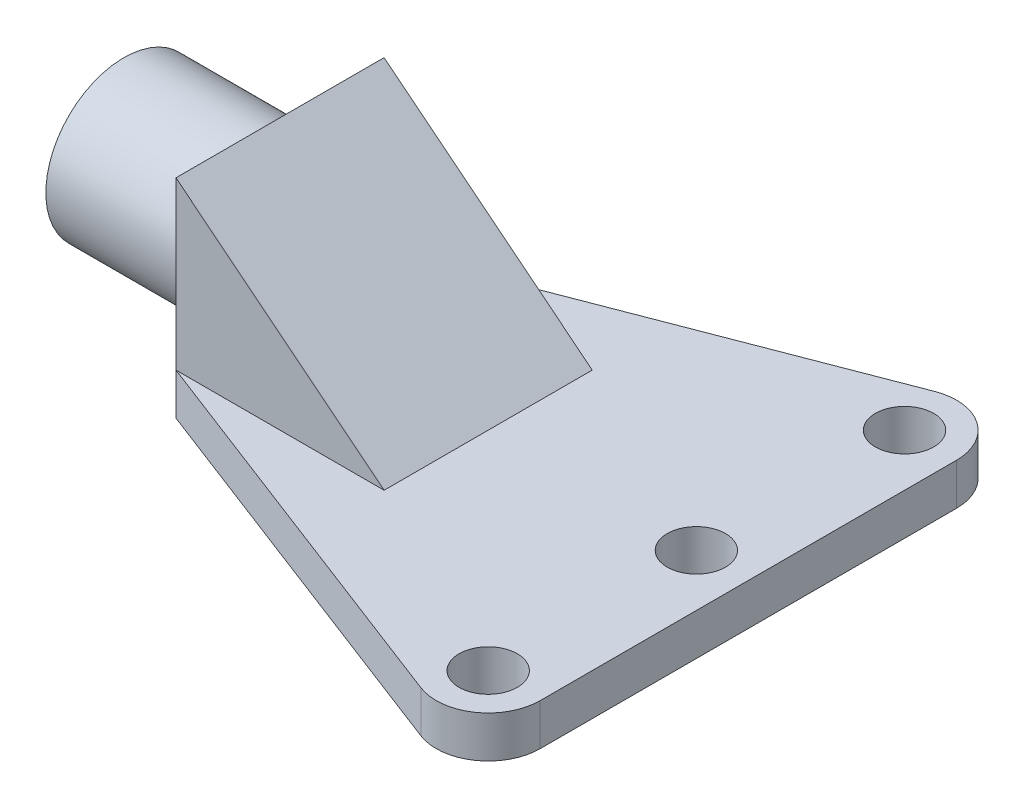
ISO-10303-21;
HEADER;
FILE_DESCRIPTION(('STEP AP214'),'2;1');
FILE_NAME('part.step','',(''),(''),'','','');
FILE_SCHEMA(('AUTOMOTIVE_DESIGN { 1 0 10303 214 1 1 1 1 }'));
ENDSEC;
DATA;
#1=APPLICATION_CONTEXT('core data for automotive mechanical design processes');
#2=APPLICATION_PROTOCOL_DEFINITION('international standard','automotive_design',2000,#1);
#3=PRODUCT_CONTEXT('',#1,'mechanical');
#4=PRODUCT('Part','Part','',(#3));
#5=PRODUCT_RELATED_PRODUCT_CATEGORY('part','',(#4));
#6=PRODUCT_DEFINITION_FORMATION('','',#4);
#7=PRODUCT_DEFINITION_CONTEXT('part definition',#1,'design');
#8=PRODUCT_DEFINITION('design','',#6,#7);
#9=PRODUCT_DEFINITION_SHAPE('','',#8);
#10=(LENGTH_UNIT() NAMED_UNIT(*) SI_UNIT(.MILLI.,.METRE.));
#11=(NAMED_UNIT(*) PLANE_ANGLE_UNIT() SI_UNIT($,.RADIAN.));
#12=(NAMED_UNIT(*) SI_UNIT($,.STERADIAN.) SOLID_ANGLE_UNIT());
#13=UNCERTAINTY_MEASURE_WITH_UNIT(LENGTH_MEASURE(1.E-05),#10,'distance_accuracy_value','');
#14=(GEOMETRIC_REPRESENTATION_CONTEXT(3) GLOBAL_UNCERTAINTY_ASSIGNED_CONTEXT((#13)) GLOBAL_UNIT_ASSIGNED_CONTEXT((#10,
#11,#12)) REPRESENTATION_CONTEXT('',''));
#15=CARTESIAN_POINT('',(0.,0.,0.));
#16=DIRECTION('',(0.,0.,1.));
#17=DIRECTION('',(1.,0.,0.));
#18=AXIS2_PLACEMENT_3D('',#15,#16,#17);
#19=CARTESIAN_POINT('',(0.,5.08,-25.4));
#20=DIRECTION('',(0.,1.,0.));
#21=DIRECTION('',(0.,0.,1.));
#22=AXIS2_PLACEMENT_3D('',#19,#20,#21);
#23=PLANE('',#22);
#24=CARTESIAN_POINT('',(0.,5.08,0.));
#25=DIRECTION('',(0.,1.,0.));
#26=DIRECTION('',(0.,0.,1.));
#27=AXIS2_PLACEMENT_3D('',#24,#25,#26);
#28=CIRCLE('',#27,3.556);
#29=CARTESIAN_POINT('',(0.,5.08,-3.556));
#30=VERTEX_POINT('',#29);
#31=EDGE_CURVE('E206',#30,#30,#28,.T.);
#32=ORIENTED_EDGE('',*,*,#31,.F.);
#33=EDGE_LOOP('',(#32));
#34=FACE_BOUND('',#33,.T.);
#35=CARTESIAN_POINT('',(0.,5.08,-25.4));
#36=DIRECTION('',(0.,1.,0.));
#37=DIRECTION('',(0.,0.,1.));
#38=AXIS2_PLACEMENT_3D('',#35,#36,#37);
#39=CIRCLE('',#38,3.556);
#40=CARTESIAN_POINT('',(0.,5.08,-28.956));
#41=VERTEX_POINT('',#40);
#42=EDGE_CURVE('E144',#41,#41,#39,.T.);
#43=ORIENTED_EDGE('',*,*,#42,.F.);
#44=EDGE_LOOP('',(#43));
#45=FACE_BOUND('',#44,.T.);
#46=CARTESIAN_POINT('',(0.,5.08,25.4));
#47=DIRECTION('',(0.,1.,0.));
#48=DIRECTION('',(0.,0.,1.));
#49=AXIS2_PLACEMENT_3D('',#46,#47,#48);
#50=CIRCLE('',#49,3.556);
#51=CARTESIAN_POINT('',(0.,5.08,21.844));
#52=VERTEX_POINT('',#51);
#53=EDGE_CURVE('E150',#52,#52,#50,.T.);
#54=ORIENTED_EDGE('',*,*,#53,.F.);
#55=EDGE_LOOP('',(#54));
#56=FACE_BOUND('',#55,.T.);
#57=DIRECTION('',(-0.933570914337952,0.,0.35839272858444));
#58=VECTOR('',#57,1.);
#59=CARTESIAN_POINT('',(-50.8,5.08,-12.7));
#60=LINE('',#59,#58);
#61=CARTESIAN_POINT('',(-2.27579382651031,5.08,-31.3281753060437));
#62=VERTEX_POINT('',#61);
#63=CARTESIAN_POINT('',(-50.8,5.08,-12.7));
#64=VERTEX_POINT('',#63);
#65=EDGE_CURVE('E129',#62,#64,#60,.T.);
#66=ORIENTED_EDGE('',*,*,#65,.T.);
#67=DIRECTION('',(1.,0.,0.));
#68=VECTOR('',#67,1.);
#69=CARTESIAN_POINT('',(0.,5.08,-12.7));
#70=LINE('',#69,#68);
#71=CARTESIAN_POINT('',(-25.4,5.08,-12.7));
#72=VERTEX_POINT('',#71);
#73=EDGE_CURVE('E123',#64,#72,#70,.T.);
#74=ORIENTED_EDGE('',*,*,#73,.T.);
#75=DIRECTION('',(0.,0.,-1.));
#76=VECTOR('',#75,1.);
#77=CARTESIAN_POINT('',(-25.4,5.08,31.7507145946854));
#78=LINE('',#77,#76);
#79=CARTESIAN_POINT('',(-25.4,5.08,12.7));
#80=VERTEX_POINT('',#79);
#81=EDGE_CURVE('E111',#80,#72,#78,.T.);
#82=ORIENTED_EDGE('',*,*,#81,.F.);
#83=DIRECTION('',(-1.,0.,0.));
#84=VECTOR('',#83,1.);
#85=CARTESIAN_POINT('',(0.,5.08,12.7));
#86=LINE('',#85,#84);
#87=CARTESIAN_POINT('',(-50.8,5.08,12.7));
#88=VERTEX_POINT('',#87);
#89=EDGE_CURVE('E131',#80,#88,#86,.T.);
#90=ORIENTED_EDGE('',*,*,#89,.T.);
#91=DIRECTION('',(0.933572882255343,0.,0.358387602348981));
#92=VECTOR('',#91,1.);
#93=CARTESIAN_POINT('',(-50.8,5.08,12.7));
#94=LINE('',#93,#92);
#95=CARTESIAN_POINT('',(-2.27565898918961,5.08,31.3279213556592));
#96=VERTEX_POINT('',#95);
#97=EDGE_CURVE('E89',#88,#96,#94,.T.);
#98=ORIENTED_EDGE('',*,*,#97,.T.);
#99=CARTESIAN_POINT('',(0.,5.08,25.4));
#100=DIRECTION('',(0.,1.,0.));
#101=DIRECTION('',(0.,0.,1.));
#102=AXIS2_PLACEMENT_3D('',#99,#100,#101);
#103=CIRCLE('',#102,6.34971459468536);
#104=CARTESIAN_POINT('',(6.34971459468536,5.08,25.4));
#105=VERTEX_POINT('',#104);
#106=EDGE_CURVE('E155',#96,#105,#103,.T.);
#107=ORIENTED_EDGE('',*,*,#106,.T.);
#108=DIRECTION('',(5.61821480663238E-06,0.,-0.999999999984218));
#109=VECTOR('',#108,1.);
#110=CARTESIAN_POINT('',(6.34999999999754,5.08,-25.4));
#111=LINE('',#110,#109);
#112=CARTESIAN_POINT('',(6.34999999999754,5.08,-25.4));
#113=VERTEX_POINT('',#112);
#114=EDGE_CURVE('E157',#105,#113,#111,.T.);
#115=ORIENTED_EDGE('',*,*,#114,.T.);
#116=CARTESIAN_POINT('',(0.,5.08,-25.4));
#117=DIRECTION('',(0.,1.,0.));
#118=DIRECTION('',(0.,0.,1.));
#119=AXIS2_PLACEMENT_3D('',#116,#117,#118);
#120=CIRCLE('',#119,6.34999999999754);
#121=EDGE_CURVE('E52',#113,#62,#120,.T.);
#122=ORIENTED_EDGE('',*,*,#121,.T.);
#123=EDGE_LOOP('',(#66,#74,#82,#90,#98,#107,#115,#122));
#124=FACE_BOUND('',#123,.T.);
#125=ADVANCED_FACE('F35',(#34,#45,#56,#124),#23,.T.);
#126=CARTESIAN_POINT('',(-50.8,5.08,12.7));
#127=DIRECTION('',(1.,0.,0.));
#128=DIRECTION('',(0.,0.,-1.));
#129=AXIS2_PLACEMENT_3D('',#126,#127,#128);
#130=PLANE('',#129);
#131=DIRECTION('',(0.,-1.,0.));
#132=VECTOR('',#131,1.);
#133=CARTESIAN_POINT('',(-50.8,5.08,12.7));
#134=LINE('',#133,#132);
#135=CARTESIAN_POINT('',(-50.8,0.,12.7));
#136=VERTEX_POINT('',#135);
#137=EDGE_CURVE('E11',#88,#136,#134,.T.);
#138=ORIENTED_EDGE('',*,*,#137,.F.);
#139=DIRECTION('',(0.,-1.,0.));
#140=VECTOR('',#139,1.);
#141=CARTESIAN_POINT('',(-50.8,25.4,12.7));
#142=LINE('',#141,#140);
#143=CARTESIAN_POINT('',(-50.8,25.4,12.7));
#144=VERTEX_POINT('',#143);
#145=EDGE_CURVE('E201',#144,#88,#142,.T.);
#146=ORIENTED_EDGE('',*,*,#145,.F.);
#147=DIRECTION('',(0.,0.,1.));
#148=VECTOR('',#147,1.);
#149=CARTESIAN_POINT('',(-50.8,25.4,12.7));
#150=LINE('',#149,#148);
#151=CARTESIAN_POINT('',(-50.8,25.4,-12.7));
#152=VERTEX_POINT('',#151);
#153=EDGE_CURVE('E119',#152,#144,#150,.T.);
#154=ORIENTED_EDGE('',*,*,#153,.F.);
#155=DIRECTION('',(0.,-1.,0.));
#156=VECTOR('',#155,1.);
#157=CARTESIAN_POINT('',(-50.8,25.4,-12.7));
#158=LINE('',#157,#156);
#159=EDGE_CURVE('E125',#152,#64,#158,.T.);
#160=ORIENTED_EDGE('',*,*,#159,.T.);
#161=DIRECTION('',(0.,-1.,0.));
#162=VECTOR('',#161,1.);
#163=CARTESIAN_POINT('',(-50.8,5.08,-12.7));
#164=LINE('',#163,#162);
#165=CARTESIAN_POINT('',(-50.8,0.,-12.7));
#166=VERTEX_POINT('',#165);
#167=EDGE_CURVE('E161',#64,#166,#164,.T.);
#168=ORIENTED_EDGE('',*,*,#167,.T.);
#169=DIRECTION('',(0.,0.,1.));
#170=VECTOR('',#169,1.);
#171=CARTESIAN_POINT('',(-50.8,0.,12.7));
#172=LINE('',#171,#170);
#173=EDGE_CURVE('E153',#166,#136,#172,.T.);
#174=ORIENTED_EDGE('',*,*,#173,.T.);
#175=EDGE_LOOP('',(#138,#146,#154,#160,#168,#174));
#176=FACE_BOUND('',#175,.T.);
#177=CARTESIAN_POINT('',(-50.8,12.7,0.));
#178=DIRECTION('',(-1.,0.,0.));
#179=DIRECTION('',(0.,0.,1.));
#180=AXIS2_PLACEMENT_3D('',#177,#178,#179);
#181=CIRCLE('',#180,9.525);
#182=CARTESIAN_POINT('',(-50.8,12.7,-9.525));
#183=VERTEX_POINT('',#182);
#184=EDGE_CURVE('E130',#183,#183,#181,.T.);
#185=ORIENTED_EDGE('',*,*,#184,.F.);
#186=EDGE_LOOP('',(#185));
#187=FACE_BOUND('',#186,.T.);
#188=ADVANCED_FACE('F37',(#176,#187),#130,.F.);
#189=CARTESIAN_POINT('',(-50.8,5.08,12.7));
#190=DIRECTION('',(0.358387602348981,0.,-0.933572882255343));
#191=DIRECTION('',(-0.933572882255343,0.,-0.358387602348981));
#192=AXIS2_PLACEMENT_3D('',#189,#190,#191);
#193=PLANE('',#192);
#194=DIRECTION('',(0.933572882255343,0.,0.358387602348981));
#195=VECTOR('',#194,1.);
#196=CARTESIAN_POINT('',(-50.8,0.,12.7));
#197=LINE('',#196,#195);
#198=CARTESIAN_POINT('',(-2.27565898918961,0.,31.3279213556592));
#199=VERTEX_POINT('',#198);
#200=EDGE_CURVE('E164',#136,#199,#197,.T.);
#201=ORIENTED_EDGE('',*,*,#200,.T.);
#202=DIRECTION('',(0.,-1.,0.));
#203=VECTOR('',#202,1.);
#204=CARTESIAN_POINT('',(-2.27565898918961,5.08,31.3279213556592));
#205=LINE('',#204,#203);
#206=EDGE_CURVE('E44',#96,#199,#205,.T.);
#207=ORIENTED_EDGE('',*,*,#206,.F.);
#208=ORIENTED_EDGE('',*,*,#97,.F.);
#209=ORIENTED_EDGE('',*,*,#137,.T.);
#210=EDGE_LOOP('',(#201,#207,#208,#209));
#211=FACE_BOUND('',#210,.T.);
#212=ADVANCED_FACE('F229',(#211),#193,.F.);
#213=CARTESIAN_POINT('',(0.,5.08,25.4));
#214=DIRECTION('',(0.,-1.,0.));
#215=DIRECTION('',(0.,0.,-1.));
#216=AXIS2_PLACEMENT_3D('',#213,#214,#215);
#217=CYLINDRICAL_SURFACE('',#216,6.34971459468536);
#218=CARTESIAN_POINT('',(0.,0.,25.4));
#219=DIRECTION('',(0.,1.,0.));
#220=DIRECTION('',(0.,0.,1.));
#221=AXIS2_PLACEMENT_3D('',#218,#219,#220);
#222=CIRCLE('',#221,6.34971459468536);
#223=CARTESIAN_POINT('',(6.34971459468536,0.,25.4));
#224=VERTEX_POINT('',#223);
#225=EDGE_CURVE('E166',#199,#224,#222,.T.);
#226=ORIENTED_EDGE('',*,*,#225,.T.);
#227=DIRECTION('',(0.,-1.,0.));
#228=VECTOR('',#227,1.);
#229=CARTESIAN_POINT('',(6.34971459468536,5.08,25.4));
#230=LINE('',#229,#228);
#231=EDGE_CURVE('E177',#105,#224,#230,.T.);
#232=ORIENTED_EDGE('',*,*,#231,.F.);
#233=ORIENTED_EDGE('',*,*,#106,.F.);
#234=ORIENTED_EDGE('',*,*,#206,.T.);
#235=EDGE_LOOP('',(#226,#232,#233,#234));
#236=FACE_BOUND('',#235,.T.);
#237=ADVANCED_FACE('F183',(#236),#217,.T.);
#238=CARTESIAN_POINT('',(6.34999999999754,5.08,-25.4));
#239=DIRECTION('',(-0.999999999984218,0.,-5.61821480663238E-06));
#240=DIRECTION('',(-5.61821480663238E-06,0.,0.999999999984218));
#241=AXIS2_PLACEMENT_3D('',#238,#239,#240);
#242=PLANE('',#241);
#243=DIRECTION('',(5.61821480663238E-06,0.,-0.999999999984218));
#244=VECTOR('',#243,1.);
#245=CARTESIAN_POINT('',(6.34999999999754,0.,-25.4));
#246=LINE('',#245,#244);
#247=CARTESIAN_POINT('',(6.34999999999754,0.,-25.4));
#248=VERTEX_POINT('',#247);
#249=EDGE_CURVE('E168',#224,#248,#246,.T.);
#250=ORIENTED_EDGE('',*,*,#249,.T.);
#251=DIRECTION('',(0.,-1.,0.));
#252=VECTOR('',#251,1.);
#253=CARTESIAN_POINT('',(6.34999999999754,5.08,-25.4));
#254=LINE('',#253,#252);
#255=EDGE_CURVE('E175',#113,#248,#254,.T.);
#256=ORIENTED_EDGE('',*,*,#255,.F.);
#257=ORIENTED_EDGE('',*,*,#114,.F.);
#258=ORIENTED_EDGE('',*,*,#231,.T.);
#259=EDGE_LOOP('',(#250,#256,#257,#258));
#260=FACE_BOUND('',#259,.T.);
#261=ADVANCED_FACE('F193',(#260),#242,.F.);
#262=CARTESIAN_POINT('',(0.,5.08,-25.4));
#263=DIRECTION('',(0.,-1.,0.));
#264=DIRECTION('',(0.,0.,-1.));
#265=AXIS2_PLACEMENT_3D('',#262,#263,#264);
#266=CYLINDRICAL_SURFACE('',#265,6.34999999999754);
#267=CARTESIAN_POINT('',(0.,0.,-25.4));
#268=DIRECTION('',(0.,1.,0.));
#269=DIRECTION('',(0.,0.,1.));
#270=AXIS2_PLACEMENT_3D('',#267,#268,#269);
#271=CIRCLE('',#270,6.34999999999754);
#272=CARTESIAN_POINT('',(-2.27579382651031,0.,-31.3281753060437));
#273=VERTEX_POINT('',#272);
#274=EDGE_CURVE('E75',#248,#273,#271,.T.);
#275=ORIENTED_EDGE('',*,*,#274,.T.);
#276=DIRECTION('',(0.,-1.,0.));
#277=VECTOR('',#276,1.);
#278=CARTESIAN_POINT('',(-2.27579382651031,5.08,-31.3281753060437));
#279=LINE('',#278,#277);
#280=EDGE_CURVE('E173',#62,#273,#279,.T.);
#281=ORIENTED_EDGE('',*,*,#280,.F.);
#282=ORIENTED_EDGE('',*,*,#121,.F.);
#283=ORIENTED_EDGE('',*,*,#255,.T.);
#284=EDGE_LOOP('',(#275,#281,#282,#283));
#285=FACE_BOUND('',#284,.T.);
#286=ADVANCED_FACE('F195',(#285),#266,.T.);
#287=CARTESIAN_POINT('',(-50.8,5.08,-12.7));
#288=DIRECTION('',(0.35839272858444,0.,0.933570914337952));
#289=DIRECTION('',(0.933570914337952,0.,-0.35839272858444));
#290=AXIS2_PLACEMENT_3D('',#287,#288,#289);
#291=PLANE('',#290);
#292=DIRECTION('',(-0.933570914337952,0.,0.35839272858444));
#293=VECTOR('',#292,1.);
#294=CARTESIAN_POINT('',(-50.8,0.,-12.7));
#295=LINE('',#294,#293);
#296=EDGE_CURVE('E82',#273,#166,#295,.T.);
#297=ORIENTED_EDGE('',*,*,#296,.T.);
#298=ORIENTED_EDGE('',*,*,#167,.F.);
#299=ORIENTED_EDGE('',*,*,#65,.F.);
#300=ORIENTED_EDGE('',*,*,#280,.T.);
#301=EDGE_LOOP('',(#297,#298,#299,#300));
#302=FACE_BOUND('',#301,.T.);
#303=ADVANCED_FACE('F196',(#302),#291,.F.);
#304=CARTESIAN_POINT('',(0.,0.,-25.4));
#305=DIRECTION('',(0.,1.,0.));
#306=DIRECTION('',(0.,0.,1.));
#307=AXIS2_PLACEMENT_3D('',#304,#305,#306);
#308=PLANE('',#307);
#309=CARTESIAN_POINT('',(0.,0.,0.));
#310=DIRECTION('',(0.,1.,0.));
#311=DIRECTION('',(0.,0.,1.));
#312=AXIS2_PLACEMENT_3D('',#309,#310,#311);
#313=CIRCLE('',#312,3.556);
#314=CARTESIAN_POINT('',(0.,0.,-3.556));
#315=VERTEX_POINT('',#314);
#316=EDGE_CURVE('E209',#315,#315,#313,.T.);
#317=ORIENTED_EDGE('',*,*,#316,.T.);
#318=EDGE_LOOP('',(#317));
#319=FACE_BOUND('',#318,.T.);
#320=ORIENTED_EDGE('',*,*,#173,.F.);
#321=ORIENTED_EDGE('',*,*,#296,.F.);
#322=ORIENTED_EDGE('',*,*,#274,.F.);
#323=ORIENTED_EDGE('',*,*,#249,.F.);
#324=ORIENTED_EDGE('',*,*,#225,.F.);
#325=ORIENTED_EDGE('',*,*,#200,.F.);
#326=EDGE_LOOP('',(#320,#321,#322,#323,#324,#325));
#327=FACE_BOUND('',#326,.T.);
#328=CARTESIAN_POINT('',(0.,0.,25.4));
#329=DIRECTION('',(0.,1.,0.));
#330=DIRECTION('',(0.,0.,1.));
#331=AXIS2_PLACEMENT_3D('',#328,#329,#330);
#332=CIRCLE('',#331,3.556);
#333=CARTESIAN_POINT('',(0.,0.,21.844));
#334=VERTEX_POINT('',#333);
#335=EDGE_CURVE('E147',#334,#334,#332,.T.);
#336=ORIENTED_EDGE('',*,*,#335,.T.);
#337=EDGE_LOOP('',(#336));
#338=FACE_BOUND('',#337,.T.);
#339=CARTESIAN_POINT('',(0.,0.,-25.4));
#340=DIRECTION('',(0.,1.,0.));
#341=DIRECTION('',(0.,0.,1.));
#342=AXIS2_PLACEMENT_3D('',#339,#340,#341);
#343=CIRCLE('',#342,3.556);
#344=CARTESIAN_POINT('',(0.,0.,-28.956));
#345=VERTEX_POINT('',#344);
#346=EDGE_CURVE('E140',#345,#345,#343,.T.);
#347=ORIENTED_EDGE('',*,*,#346,.T.);
#348=EDGE_LOOP('',(#347));
#349=FACE_BOUND('',#348,.T.);
#350=ADVANCED_FACE('F189',(#319,#327,#338,#349),#308,.F.);
#351=CARTESIAN_POINT('',(0.,25.401,25.4));
#352=DIRECTION('',(0.,-1.,0.));
#353=DIRECTION('',(0.,0.,-1.));
#354=AXIS2_PLACEMENT_3D('',#351,#352,#353);
#355=CYLINDRICAL_SURFACE('',#354,3.556);
#356=CARTESIAN_POINT('',(0.,5.08,21.844));
#357=CARTESIAN_POINT('',(0.,5.02708333333333,21.844));
#358=CARTESIAN_POINT('',(0.,4.97416666666667,21.844));
#359=CARTESIAN_POINT('',(0.,4.86833333333333,21.844));
#360=CARTESIAN_POINT('',(0.,4.81541666666667,21.844));
#361=CARTESIAN_POINT('',(0.,4.70958333333333,21.844));
#362=CARTESIAN_POINT('',(0.,4.65666666666666,21.844));
#363=CARTESIAN_POINT('',(0.,4.55083333333333,21.844));
#364=CARTESIAN_POINT('',(0.,4.49791666666666,21.844));
#365=CARTESIAN_POINT('',(0.,4.39208333333333,21.844));
#366=CARTESIAN_POINT('',(0.,4.33916666666666,21.844));
#367=CARTESIAN_POINT('',(0.,4.23333333333333,21.844));
#368=CARTESIAN_POINT('',(0.,4.18041666666666,21.844));
#369=CARTESIAN_POINT('',(0.,4.07458333333333,21.844));
#370=CARTESIAN_POINT('',(0.,4.02166666666666,21.844));
#371=CARTESIAN_POINT('',(0.,3.91583333333333,21.844));
#372=CARTESIAN_POINT('',(0.,3.86291666666666,21.844));
#373=CARTESIAN_POINT('',(0.,3.75708333333333,21.844));
#374=CARTESIAN_POINT('',(0.,3.70416666666666,21.844));
#375=CARTESIAN_POINT('',(0.,3.59833333333333,21.844));
#376=CARTESIAN_POINT('',(0.,3.54541666666667,21.844));
#377=CARTESIAN_POINT('',(0.,3.43958333333333,21.844));
#378=CARTESIAN_POINT('',(0.,3.38666666666666,21.844));
#379=CARTESIAN_POINT('',(0.,3.28083333333333,21.844));
#380=CARTESIAN_POINT('',(0.,3.22791666666666,21.844));
#381=CARTESIAN_POINT('',(0.,3.12208333333333,21.844));
#382=CARTESIAN_POINT('',(0.,3.06916666666666,21.844));
#383=CARTESIAN_POINT('',(0.,2.96333333333333,21.844));
#384=CARTESIAN_POINT('',(0.,2.91041666666666,21.844));
#385=CARTESIAN_POINT('',(0.,2.80458333333333,21.844));
#386=CARTESIAN_POINT('',(0.,2.75166666666666,21.844));
#387=CARTESIAN_POINT('',(0.,2.64583333333333,21.844));
#388=CARTESIAN_POINT('',(0.,2.59291666666666,21.844));
#389=CARTESIAN_POINT('',(0.,2.48708333333333,21.844));
#390=CARTESIAN_POINT('',(0.,2.43416666666666,21.844));
#391=CARTESIAN_POINT('',(0.,2.32833333333333,21.844));
#392=CARTESIAN_POINT('',(0.,2.27541666666667,21.844));
#393=CARTESIAN_POINT('',(0.,2.16958333333333,21.844));
#394=CARTESIAN_POINT('',(0.,2.11666666666666,21.844));
#395=CARTESIAN_POINT('',(0.,2.01083333333333,21.844));
#396=CARTESIAN_POINT('',(0.,1.95791666666666,21.844));
#397=CARTESIAN_POINT('',(0.,1.85208333333333,21.844));
#398=CARTESIAN_POINT('',(0.,1.79916666666666,21.844));
#399=CARTESIAN_POINT('',(0.,1.69333333333333,21.844));
#400=CARTESIAN_POINT('',(0.,1.64041666666666,21.844));
#401=CARTESIAN_POINT('',(0.,1.53458333333333,21.844));
#402=CARTESIAN_POINT('',(0.,1.48166666666666,21.844));
#403=CARTESIAN_POINT('',(0.,1.37583333333333,21.844));
#404=CARTESIAN_POINT('',(0.,1.32291666666666,21.844));
#405=CARTESIAN_POINT('',(0.,1.21708333333333,21.844));
#406=CARTESIAN_POINT('',(0.,1.16416666666666,21.844));
#407=CARTESIAN_POINT('',(0.,1.05833333333333,21.844));
#408=CARTESIAN_POINT('',(0.,1.00541666666666,21.844));
#409=CARTESIAN_POINT('',(0.,0.899583333333331,21.844));
#410=CARTESIAN_POINT('',(0.,0.846666666666663,21.844));
#411=CARTESIAN_POINT('',(0.,0.740833333333329,21.844));
#412=CARTESIAN_POINT('',(0.,0.687916666666663,21.844));
#413=CARTESIAN_POINT('',(0.,0.58208333333333,21.844));
#414=CARTESIAN_POINT('',(0.,0.529166666666664,21.844));
#415=CARTESIAN_POINT('',(0.,0.42333333333333,21.844));
#416=CARTESIAN_POINT('',(0.,0.370416666666662,21.844));
#417=CARTESIAN_POINT('',(0.,0.264583333333329,21.844));
#418=CARTESIAN_POINT('',(0.,0.211666666666662,21.844));
#419=CARTESIAN_POINT('',(0.,0.105833333333329,21.844));
#420=CARTESIAN_POINT('',(0.,0.0529166666666629,21.844));
#421=CARTESIAN_POINT('',(0.,0.,21.844));
#422=B_SPLINE_CURVE_WITH_KNOTS('',3,(#356,#357,#358,#359,#360,#361,#362,#363,#364,#365,#366,
#367,#368,#369,#370,#371,#372,#373,#374,#375,#376,#377,#378,#379,#380,#381,#382,#383,#384,#385,
#386,#387,#388,#389,#390,#391,#392,#393,#394,#395,#396,#397,#398,#399,#400,#401,#402,#403,#404,
#405,#406,#407,#408,#409,#410,#411,#412,#413,#414,#415,#416,#417,#418,#419,#420,#421),
.UNSPECIFIED.,.F.,.F.,(4,2,2,2,2,2,2,2,2,2,2,2,2,2,2,2,2,2,2,2,2,2,2,2,2,2,2,2,2,2,2,2,4),(0.,
0.158749999999999,0.317499999999998,0.476250000000001,0.635,0.793749999999999,0.952500000000002,
1.11125,1.27,1.42875,1.5875,1.74625,1.905,2.06375,2.2225,2.38125,2.54,2.69875,2.8575,3.01625,
3.175,3.33375,3.4925,3.65125,3.81,3.96875,4.1275,4.28625,4.445,4.60375,4.7625,4.92125,5.08),.UNSPECIFIED.);
#423=EDGE_CURVE('BSEAM234',#52,#334,#422,.T.);
#424=ORIENTED_EDGE('',*,*,#53,.T.);
#425=ORIENTED_EDGE('',*,*,#335,.F.);
#426=ORIENTED_EDGE('',*,*,#423,.T.);
#427=ORIENTED_EDGE('',*,*,#423,.F.);
#428=EDGE_LOOP('',(#424,#426,#425,#427));
#429=FACE_BOUND('',#428,.T.);
#430=ADVANCED_FACE('F234',(#429),#355,.F.);
#431=CARTESIAN_POINT('',(0.,25.401,-25.4));
#432=DIRECTION('',(0.,-1.,0.));
#433=DIRECTION('',(0.,0.,-1.));
#434=AXIS2_PLACEMENT_3D('',#431,#432,#433);
#435=CYLINDRICAL_SURFACE('',#434,3.556);
#436=CARTESIAN_POINT('',(0.,5.08,-28.956));
#437=CARTESIAN_POINT('',(0.,5.02708333333333,-28.956));
#438=CARTESIAN_POINT('',(0.,4.97416666666667,-28.956));
#439=CARTESIAN_POINT('',(0.,4.86833333333333,-28.956));
#440=CARTESIAN_POINT('',(0.,4.81541666666667,-28.956));
#441=CARTESIAN_POINT('',(0.,4.70958333333333,-28.956));
#442=CARTESIAN_POINT('',(0.,4.65666666666666,-28.956));
#443=CARTESIAN_POINT('',(0.,4.55083333333333,-28.956));
#444=CARTESIAN_POINT('',(0.,4.49791666666666,-28.956));
#445=CARTESIAN_POINT('',(0.,4.39208333333333,-28.956));
#446=CARTESIAN_POINT('',(0.,4.33916666666666,-28.956));
#447=CARTESIAN_POINT('',(0.,4.23333333333333,-28.956));
#448=CARTESIAN_POINT('',(0.,4.18041666666666,-28.956));
#449=CARTESIAN_POINT('',(0.,4.07458333333333,-28.956));
#450=CARTESIAN_POINT('',(0.,4.02166666666666,-28.956));
#451=CARTESIAN_POINT('',(0.,3.91583333333333,-28.956));
#452=CARTESIAN_POINT('',(0.,3.86291666666666,-28.956));
#453=CARTESIAN_POINT('',(0.,3.75708333333333,-28.956));
#454=CARTESIAN_POINT('',(0.,3.70416666666666,-28.956));
#455=CARTESIAN_POINT('',(0.,3.59833333333333,-28.956));
#456=CARTESIAN_POINT('',(0.,3.54541666666667,-28.956));
#457=CARTESIAN_POINT('',(0.,3.43958333333333,-28.956));
#458=CARTESIAN_POINT('',(0.,3.38666666666666,-28.956));
#459=CARTESIAN_POINT('',(0.,3.28083333333333,-28.956));
#460=CARTESIAN_POINT('',(0.,3.22791666666666,-28.956));
#461=CARTESIAN_POINT('',(0.,3.12208333333333,-28.956));
#462=CARTESIAN_POINT('',(0.,3.06916666666666,-28.956));
#463=CARTESIAN_POINT('',(0.,2.96333333333333,-28.956));
#464=CARTESIAN_POINT('',(0.,2.91041666666666,-28.956));
#465=CARTESIAN_POINT('',(0.,2.80458333333333,-28.956));
#466=CARTESIAN_POINT('',(0.,2.75166666666666,-28.956));
#467=CARTESIAN_POINT('',(0.,2.64583333333333,-28.956));
#468=CARTESIAN_POINT('',(0.,2.59291666666666,-28.956));
#469=CARTESIAN_POINT('',(0.,2.48708333333333,-28.956));
#470=CARTESIAN_POINT('',(0.,2.43416666666666,-28.956));
#471=CARTESIAN_POINT('',(0.,2.32833333333333,-28.956));
#472=CARTESIAN_POINT('',(0.,2.27541666666667,-28.956));
#473=CARTESIAN_POINT('',(0.,2.16958333333333,-28.956));
#474=CARTESIAN_POINT('',(0.,2.11666666666666,-28.956));
#475=CARTESIAN_POINT('',(0.,2.01083333333333,-28.956));
#476=CARTESIAN_POINT('',(0.,1.95791666666666,-28.956));
#477=CARTESIAN_POINT('',(0.,1.85208333333333,-28.956));
#478=CARTESIAN_POINT('',(0.,1.79916666666666,-28.956));
#479=CARTESIAN_POINT('',(0.,1.69333333333333,-28.956));
#480=CARTESIAN_POINT('',(0.,1.64041666666666,-28.956));
#481=CARTESIAN_POINT('',(0.,1.53458333333333,-28.956));
#482=CARTESIAN_POINT('',(0.,1.48166666666666,-28.956));
#483=CARTESIAN_POINT('',(0.,1.37583333333333,-28.956));
#484=CARTESIAN_POINT('',(0.,1.32291666666666,-28.956));
#485=CARTESIAN_POINT('',(0.,1.21708333333333,-28.956));
#486=CARTESIAN_POINT('',(0.,1.16416666666666,-28.956));
#487=CARTESIAN_POINT('',(0.,1.05833333333333,-28.956));
#488=CARTESIAN_POINT('',(0.,1.00541666666666,-28.956));
#489=CARTESIAN_POINT('',(0.,0.899583333333331,-28.956));
#490=CARTESIAN_POINT('',(0.,0.846666666666663,-28.956));
#491=CARTESIAN_POINT('',(0.,0.740833333333329,-28.956));
#492=CARTESIAN_POINT('',(0.,0.687916666666663,-28.956));
#493=CARTESIAN_POINT('',(0.,0.58208333333333,-28.956));
#494=CARTESIAN_POINT('',(0.,0.529166666666664,-28.956));
#495=CARTESIAN_POINT('',(0.,0.42333333333333,-28.956));
#496=CARTESIAN_POINT('',(0.,0.370416666666662,-28.956));
#497=CARTESIAN_POINT('',(0.,0.264583333333329,-28.956));
#498=CARTESIAN_POINT('',(0.,0.211666666666662,-28.956));
#499=CARTESIAN_POINT('',(0.,0.105833333333329,-28.956));
#500=CARTESIAN_POINT('',(0.,0.0529166666666629,-28.956));
#501=CARTESIAN_POINT('',(0.,0.,-28.956));
#502=B_SPLINE_CURVE_WITH_KNOTS('',3,(#436,#437,#438,#439,#440,#441,#442,#443,#444,#445,#446,
#447,#448,#449,#450,#451,#452,#453,#454,#455,#456,#457,#458,#459,#460,#461,#462,#463,#464,#465,
#466,#467,#468,#469,#470,#471,#472,#473,#474,#475,#476,#477,#478,#479,#480,#481,#482,#483,#484,
#485,#486,#487,#488,#489,#490,#491,#492,#493,#494,#495,#496,#497,#498,#499,#500,#501),
.UNSPECIFIED.,.F.,.F.,(4,2,2,2,2,2,2,2,2,2,2,2,2,2,2,2,2,2,2,2,2,2,2,2,2,2,2,2,2,2,2,2,4),(0.,
0.158749999999999,0.317499999999998,0.476250000000001,0.635,0.793749999999999,0.952500000000002,
1.11125,1.27,1.42875,1.5875,1.74625,1.905,2.06375,2.2225,2.38125,2.54,2.69875,2.8575,3.01625,
3.175,3.33375,3.4925,3.65125,3.81,3.96875,4.1275,4.28625,4.445,4.60375,4.7625,4.92125,5.08),.UNSPECIFIED.);
#503=EDGE_CURVE('BSEAM262',#41,#345,#502,.T.);
#504=ORIENTED_EDGE('',*,*,#42,.T.);
#505=ORIENTED_EDGE('',*,*,#346,.F.);
#506=ORIENTED_EDGE('',*,*,#503,.T.);
#507=ORIENTED_EDGE('',*,*,#503,.F.);
#508=EDGE_LOOP('',(#504,#506,#505,#507));
#509=FACE_BOUND('',#508,.T.);
#510=ADVANCED_FACE('F262',(#509),#435,.F.);
#511=CARTESIAN_POINT('',(-69.85,12.7,0.));
#512=DIRECTION('',(1.,0.,0.));
#513=DIRECTION('',(0.,0.,-1.));
#514=AXIS2_PLACEMENT_3D('',#511,#512,#513);
#515=CYLINDRICAL_SURFACE('',#514,9.525);
#516=CARTESIAN_POINT('',(-69.85,12.7,0.));
#517=DIRECTION('',(-1.,0.,0.));
#518=DIRECTION('',(0.,0.,1.));
#519=AXIS2_PLACEMENT_3D('',#516,#517,#518);
#520=CIRCLE('',#519,9.525);
#521=CARTESIAN_POINT('',(-69.85,12.7,-9.525));
#522=VERTEX_POINT('',#521);
#523=EDGE_CURVE('E134',#522,#522,#520,.T.);
#524=CARTESIAN_POINT('',(-69.85,12.7,-9.525));
#525=CARTESIAN_POINT('',(-69.6515625,12.7,-9.525));
#526=CARTESIAN_POINT('',(-69.453125,12.7,-9.525));
#527=CARTESIAN_POINT('',(-69.05625,12.7,-9.525));
#528=CARTESIAN_POINT('',(-68.8578125,12.7,-9.525));
#529=CARTESIAN_POINT('',(-68.4609375,12.7,-9.525));
#530=CARTESIAN_POINT('',(-68.2625,12.7,-9.525));
#531=CARTESIAN_POINT('',(-67.865625,12.7,-9.525));
#532=CARTESIAN_POINT('',(-67.6671875,12.7,-9.525));
#533=CARTESIAN_POINT('',(-67.2703125,12.7,-9.525));
#534=CARTESIAN_POINT('',(-67.071875,12.7,-9.525));
#535=CARTESIAN_POINT('',(-66.675,12.7,-9.525));
#536=CARTESIAN_POINT('',(-66.4765625,12.7,-9.525));
#537=CARTESIAN_POINT('',(-66.0796875,12.7,-9.525));
#538=CARTESIAN_POINT('',(-65.88125,12.7,-9.525));
#539=CARTESIAN_POINT('',(-65.484375,12.7,-9.525));
#540=CARTESIAN_POINT('',(-65.2859375,12.7,-9.525));
#541=CARTESIAN_POINT('',(-64.8890625,12.7,-9.525));
#542=CARTESIAN_POINT('',(-64.690625,12.7,-9.525));
#543=CARTESIAN_POINT('',(-64.29375,12.7,-9.525));
#544=CARTESIAN_POINT('',(-64.0953125,12.7,-9.525));
#545=CARTESIAN_POINT('',(-63.6984375,12.7,-9.525));
#546=CARTESIAN_POINT('',(-63.5,12.7,-9.525));
#547=CARTESIAN_POINT('',(-63.103125,12.7,-9.525));
#548=CARTESIAN_POINT('',(-62.9046875,12.7,-9.525));
#549=CARTESIAN_POINT('',(-62.5078125,12.7,-9.525));
#550=CARTESIAN_POINT('',(-62.309375,12.7,-9.525));
#551=CARTESIAN_POINT('',(-61.9125,12.7,-9.525));
#552=CARTESIAN_POINT('',(-61.7140625,12.7,-9.525));
#553=CARTESIAN_POINT('',(-61.3171875,12.7,-9.525));
#554=CARTESIAN_POINT('',(-61.11875,12.7,-9.525));
#555=CARTESIAN_POINT('',(-60.721875,12.7,-9.525));
#556=CARTESIAN_POINT('',(-60.5234375,12.7,-9.525));
#557=CARTESIAN_POINT('',(-60.1265625,12.7,-9.525));
#558=CARTESIAN_POINT('',(-59.928125,12.7,-9.525));
#559=CARTESIAN_POINT('',(-59.53125,12.7,-9.525));
#560=CARTESIAN_POINT('',(-59.3328125,12.7,-9.525));
#561=CARTESIAN_POINT('',(-58.9359375,12.7,-9.525));
#562=CARTESIAN_POINT('',(-58.7375,12.7,-9.525));
#563=CARTESIAN_POINT('',(-58.340625,12.7,-9.525));
#564=CARTESIAN_POINT('',(-58.1421875,12.7,-9.525));
#565=CARTESIAN_POINT('',(-57.7453125,12.7,-9.525));
#566=CARTESIAN_POINT('',(-57.546875,12.7,-9.525));
#567=CARTESIAN_POINT('',(-57.15,12.7,-9.525));
#568=CARTESIAN_POINT('',(-56.9515625,12.7,-9.525));
#569=CARTESIAN_POINT('',(-56.5546875,12.7,-9.525));
#570=CARTESIAN_POINT('',(-56.35625,12.7,-9.525));
#571=CARTESIAN_POINT('',(-55.959375,12.7,-9.525));
#572=CARTESIAN_POINT('',(-55.7609375,12.7,-9.525));
#573=CARTESIAN_POINT('',(-55.3640625,12.7,-9.525));
#574=CARTESIAN_POINT('',(-55.165625,12.7,-9.525));
#575=CARTESIAN_POINT('',(-54.76875,12.7,-9.525));
#576=CARTESIAN_POINT('',(-54.5703125,12.7,-9.525));
#577=CARTESIAN_POINT('',(-54.1734375,12.7,-9.525));
#578=CARTESIAN_POINT('',(-53.975,12.7,-9.525));
#579=CARTESIAN_POINT('',(-53.578125,12.7,-9.525));
#580=CARTESIAN_POINT('',(-53.3796875,12.7,-9.525));
#581=CARTESIAN_POINT('',(-52.9828125,12.7,-9.525));
#582=CARTESIAN_POINT('',(-52.784375,12.7,-9.525));
#583=CARTESIAN_POINT('',(-52.3875,12.7,-9.525));
#584=CARTESIAN_POINT('',(-52.1890625,12.7,-9.525));
#585=CARTESIAN_POINT('',(-51.7921875,12.7,-9.525));
#586=CARTESIAN_POINT('',(-51.59375,12.7,-9.525));
#587=CARTESIAN_POINT('',(-51.196875,12.7,-9.525));
#588=CARTESIAN_POINT('',(-50.9984375,12.7,-9.525));
#589=CARTESIAN_POINT('',(-50.8,12.7,-9.525));
#590=B_SPLINE_CURVE_WITH_KNOTS('',3,(#524,#525,#526,#527,#528,#529,#530,#531,#532,#533,#534,
#535,#536,#537,#538,#539,#540,#541,#542,#543,#544,#545,#546,#547,#548,#549,#550,#551,#552,#553,
#554,#555,#556,#557,#558,#559,#560,#561,#562,#563,#564,#565,#566,#567,#568,#569,#570,#571,#572,
#573,#574,#575,#576,#577,#578,#579,#580,#581,#582,#583,#584,#585,#586,#587,#588,#589),
.UNSPECIFIED.,.F.,.F.,(4,2,2,2,2,2,2,2,2,2,2,2,2,2,2,2,2,2,2,2,2,2,2,2,2,2,2,2,2,2,2,2,4),(0.,
0.5953125,1.190625,1.7859375,2.38125,2.9765625,3.571875,4.1671875,4.7625,5.3578125,5.953125,
6.5484375,7.14375,7.7390625,8.334375,8.92968750000001,9.52500000000001,10.1203125,10.715625,
11.3109375,11.90625,12.5015625,13.096875,13.6921875,14.2875,14.8828125,15.478125,16.0734375,
16.66875,17.2640625,17.859375,18.4546875,19.05),.UNSPECIFIED.);
#591=EDGE_CURVE('BSEAM259',#522,#183,#590,.T.);
#592=ORIENTED_EDGE('',*,*,#523,.F.);
#593=ORIENTED_EDGE('',*,*,#184,.T.);
#594=ORIENTED_EDGE('',*,*,#591,.T.);
#595=ORIENTED_EDGE('',*,*,#591,.F.);
#596=EDGE_LOOP('',(#592,#594,#593,#595));
#597=FACE_BOUND('',#596,.T.);
#598=ADVANCED_FACE('F259',(#597),#515,.T.);
#599=CARTESIAN_POINT('',(-69.85,12.7,0.));
#600=DIRECTION('',(-1.,0.,0.));
#601=DIRECTION('',(0.,0.,1.));
#602=AXIS2_PLACEMENT_3D('',#599,#600,#601);
#603=PLANE('',#602);
#604=ORIENTED_EDGE('',*,*,#523,.T.);
#605=EDGE_LOOP('',(#604));
#606=FACE_BOUND('',#605,.T.);
#607=ADVANCED_FACE('F254',(#606),#603,.T.);
#608=CARTESIAN_POINT('',(-50.8,25.4,-12.7));
#609=DIRECTION('',(0.,0.,1.));
#610=DIRECTION('',(1.,0.,0.));
#611=AXIS2_PLACEMENT_3D('',#608,#609,#610);
#612=PLANE('',#611);
#613=ORIENTED_EDGE('',*,*,#73,.F.);
#614=ORIENTED_EDGE('',*,*,#159,.F.);
#615=DIRECTION('',(-0.78086880944303,0.624695047554424,0.));
#616=VECTOR('',#615,1.);
#617=CARTESIAN_POINT('',(-50.8,25.4,-12.7));
#618=LINE('',#617,#616);
#619=EDGE_CURVE('E114',#72,#152,#618,.T.);
#620=ORIENTED_EDGE('',*,*,#619,.F.);
#621=EDGE_LOOP('',(#613,#614,#620));
#622=FACE_BOUND('',#621,.T.);
#623=ADVANCED_FACE('F122',(#622),#612,.F.);
#624=CARTESIAN_POINT('',(-50.8,25.4,12.7));
#625=DIRECTION('',(0.,0.,-1.));
#626=DIRECTION('',(-1.,0.,0.));
#627=AXIS2_PLACEMENT_3D('',#624,#625,#626);
#628=PLANE('',#627);
#629=ORIENTED_EDGE('',*,*,#89,.F.);
#630=DIRECTION('',(0.78086880944303,-0.624695047554424,0.));
#631=VECTOR('',#630,1.);
#632=CARTESIAN_POINT('',(-50.8,25.4,12.7));
#633=LINE('',#632,#631);
#634=EDGE_CURVE('E117',#144,#80,#633,.T.);
#635=ORIENTED_EDGE('',*,*,#634,.F.);
#636=ORIENTED_EDGE('',*,*,#145,.T.);
#637=EDGE_LOOP('',(#629,#635,#636));
#638=FACE_BOUND('',#637,.T.);
#639=ADVANCED_FACE('F221',(#638),#628,.F.);
#640=CARTESIAN_POINT('',(-50.8,25.4,31.7507145946854));
#641=DIRECTION('',(-0.624695047554424,-0.78086880944303,0.));
#642=DIRECTION('',(0.78086880944303,-0.624695047554424,0.));
#643=AXIS2_PLACEMENT_3D('',#640,#641,#642);
#644=PLANE('',#643);
#645=ORIENTED_EDGE('',*,*,#634,.T.);
#646=ORIENTED_EDGE('',*,*,#81,.T.);
#647=ORIENTED_EDGE('',*,*,#619,.T.);
#648=ORIENTED_EDGE('',*,*,#153,.T.);
#649=EDGE_LOOP('',(#645,#646,#647,#648));
#650=FACE_BOUND('',#649,.T.);
#651=ADVANCED_FACE('F113',(#650),#644,.F.);
#652=CARTESIAN_POINT('',(0.,25.401,0.));
#653=DIRECTION('',(0.,-1.,0.));
#654=DIRECTION('',(0.,0.,-1.));
#655=AXIS2_PLACEMENT_3D('',#652,#653,#654);
#656=CYLINDRICAL_SURFACE('',#655,3.556);
#657=CARTESIAN_POINT('',(0.,5.08,-3.556));
#658=CARTESIAN_POINT('',(0.,5.02708333333333,-3.556));
#659=CARTESIAN_POINT('',(0.,4.97416666666667,-3.556));
#660=CARTESIAN_POINT('',(0.,4.86833333333333,-3.556));
#661=CARTESIAN_POINT('',(0.,4.81541666666667,-3.556));
#662=CARTESIAN_POINT('',(0.,4.70958333333333,-3.556));
#663=CARTESIAN_POINT('',(0.,4.65666666666666,-3.556));
#664=CARTESIAN_POINT('',(0.,4.55083333333333,-3.556));
#665=CARTESIAN_POINT('',(0.,4.49791666666666,-3.556));
#666=CARTESIAN_POINT('',(0.,4.39208333333333,-3.556));
#667=CARTESIAN_POINT('',(0.,4.33916666666666,-3.556));
#668=CARTESIAN_POINT('',(0.,4.23333333333333,-3.556));
#669=CARTESIAN_POINT('',(0.,4.18041666666666,-3.556));
#670=CARTESIAN_POINT('',(0.,4.07458333333333,-3.556));
#671=CARTESIAN_POINT('',(0.,4.02166666666666,-3.556));
#672=CARTESIAN_POINT('',(0.,3.91583333333333,-3.556));
#673=CARTESIAN_POINT('',(0.,3.86291666666666,-3.556));
#674=CARTESIAN_POINT('',(0.,3.75708333333333,-3.556));
#675=CARTESIAN_POINT('',(0.,3.70416666666666,-3.556));
#676=CARTESIAN_POINT('',(0.,3.59833333333333,-3.556));
#677=CARTESIAN_POINT('',(0.,3.54541666666667,-3.556));
#678=CARTESIAN_POINT('',(0.,3.43958333333333,-3.556));
#679=CARTESIAN_POINT('',(0.,3.38666666666666,-3.556));
#680=CARTESIAN_POINT('',(0.,3.28083333333333,-3.556));
#681=CARTESIAN_POINT('',(0.,3.22791666666666,-3.556));
#682=CARTESIAN_POINT('',(0.,3.12208333333333,-3.556));
#683=CARTESIAN_POINT('',(0.,3.06916666666666,-3.556));
#684=CARTESIAN_POINT('',(0.,2.96333333333333,-3.556));
#685=CARTESIAN_POINT('',(0.,2.91041666666666,-3.556));
#686=CARTESIAN_POINT('',(0.,2.80458333333333,-3.556));
#687=CARTESIAN_POINT('',(0.,2.75166666666666,-3.556));
#688=CARTESIAN_POINT('',(0.,2.64583333333333,-3.556));
#689=CARTESIAN_POINT('',(0.,2.59291666666666,-3.556));
#690=CARTESIAN_POINT('',(0.,2.48708333333333,-3.556));
#691=CARTESIAN_POINT('',(0.,2.43416666666666,-3.556));
#692=CARTESIAN_POINT('',(0.,2.32833333333333,-3.556));
#693=CARTESIAN_POINT('',(0.,2.27541666666667,-3.556));
#694=CARTESIAN_POINT('',(0.,2.16958333333333,-3.556));
#695=CARTESIAN_POINT('',(0.,2.11666666666666,-3.556));
#696=CARTESIAN_POINT('',(0.,2.01083333333333,-3.556));
#697=CARTESIAN_POINT('',(0.,1.95791666666666,-3.556));
#698=CARTESIAN_POINT('',(0.,1.85208333333333,-3.556));
#699=CARTESIAN_POINT('',(0.,1.79916666666666,-3.556));
#700=CARTESIAN_POINT('',(0.,1.69333333333333,-3.556));
#701=CARTESIAN_POINT('',(0.,1.64041666666666,-3.556));
#702=CARTESIAN_POINT('',(0.,1.53458333333333,-3.556));
#703=CARTESIAN_POINT('',(0.,1.48166666666666,-3.556));
#704=CARTESIAN_POINT('',(0.,1.37583333333333,-3.556));
#705=CARTESIAN_POINT('',(0.,1.32291666666666,-3.556));
#706=CARTESIAN_POINT('',(0.,1.21708333333333,-3.556));
#707=CARTESIAN_POINT('',(0.,1.16416666666666,-3.556));
#708=CARTESIAN_POINT('',(0.,1.05833333333333,-3.556));
#709=CARTESIAN_POINT('',(0.,1.00541666666666,-3.556));
#710=CARTESIAN_POINT('',(0.,0.899583333333331,-3.556));
#711=CARTESIAN_POINT('',(0.,0.846666666666663,-3.556));
#712=CARTESIAN_POINT('',(0.,0.740833333333329,-3.556));
#713=CARTESIAN_POINT('',(0.,0.687916666666663,-3.556));
#714=CARTESIAN_POINT('',(0.,0.58208333333333,-3.556));
#715=CARTESIAN_POINT('',(0.,0.529166666666664,-3.556));
#716=CARTESIAN_POINT('',(0.,0.42333333333333,-3.556));
#717=CARTESIAN_POINT('',(0.,0.370416666666662,-3.556));
#718=CARTESIAN_POINT('',(0.,0.264583333333329,-3.556));
#719=CARTESIAN_POINT('',(0.,0.211666666666662,-3.556));
#720=CARTESIAN_POINT('',(0.,0.105833333333329,-3.556));
#721=CARTESIAN_POINT('',(0.,0.0529166666666629,-3.556));
#722=CARTESIAN_POINT('',(0.,0.,-3.556));
#723=B_SPLINE_CURVE_WITH_KNOTS('',3,(#657,#658,#659,#660,#661,#662,#663,#664,#665,#666,#667,
#668,#669,#670,#671,#672,#673,#674,#675,#676,#677,#678,#679,#680,#681,#682,#683,#684,#685,#686,
#687,#688,#689,#690,#691,#692,#693,#694,#695,#696,#697,#698,#699,#700,#701,#702,#703,#704,#705,
#706,#707,#708,#709,#710,#711,#712,#713,#714,#715,#716,#717,#718,#719,#720,#721,#722),
.UNSPECIFIED.,.F.,.F.,(4,2,2,2,2,2,2,2,2,2,2,2,2,2,2,2,2,2,2,2,2,2,2,2,2,2,2,2,2,2,2,2,4),(0.,
0.158749999999999,0.317499999999998,0.476250000000001,0.635,0.793749999999999,0.952500000000002,
1.11125,1.27,1.42875,1.5875,1.74625,1.905,2.06375,2.2225,2.38125,2.54,2.69875,2.8575,3.01625,
3.175,3.33375,3.4925,3.65125,3.81,3.96875,4.1275,4.28625,4.445,4.60375,4.7625,4.92125,5.08),.UNSPECIFIED.);
#724=EDGE_CURVE('BSEAM214',#30,#315,#723,.T.);
#725=ORIENTED_EDGE('',*,*,#31,.T.);
#726=ORIENTED_EDGE('',*,*,#316,.F.);
#727=ORIENTED_EDGE('',*,*,#724,.T.);
#728=ORIENTED_EDGE('',*,*,#724,.F.);
#729=EDGE_LOOP('',(#725,#727,#726,#728));
#730=FACE_BOUND('',#729,.T.);
#731=ADVANCED_FACE('F214',(#730),#656,.F.);
#732=CLOSED_SHELL('',(#125,#188,#212,#237,#261,#286,#303,#350,#430,#510,#598,#607,#623,#639,
#651,#731));
#733=MANIFOLD_SOLID_BREP('B2',#732);
#734=ADVANCED_BREP_SHAPE_REPRESENTATION('',(#18,#733),#14);
#735=SHAPE_DEFINITION_REPRESENTATION(#9,#734);
ENDSEC;
END-ISO-10303-21;
